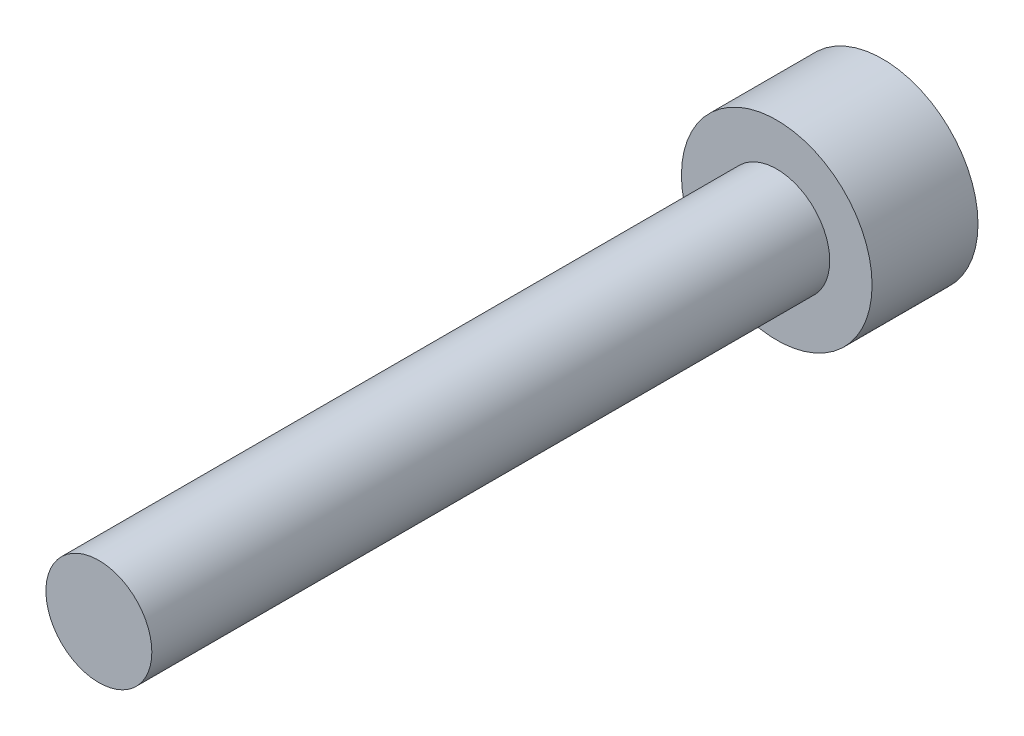
ISO-10303-21;
HEADER;
FILE_DESCRIPTION(('STEP AP214'),'2;1');
FILE_NAME('part.step','',(''),(''),'','','');
FILE_SCHEMA(('AUTOMOTIVE_DESIGN { 1 0 10303 214 1 1 1 1 }'));
ENDSEC;
DATA;
#1=APPLICATION_CONTEXT('core data for automotive mechanical design processes');
#2=APPLICATION_PROTOCOL_DEFINITION('international standard','automotive_design',2000,#1);
#3=PRODUCT_CONTEXT('',#1,'mechanical');
#4=PRODUCT('Part','Part','',(#3));
#5=PRODUCT_RELATED_PRODUCT_CATEGORY('part','',(#4));
#6=PRODUCT_DEFINITION_FORMATION('','',#4);
#7=PRODUCT_DEFINITION_CONTEXT('part definition',#1,'design');
#8=PRODUCT_DEFINITION('design','',#6,#7);
#9=PRODUCT_DEFINITION_SHAPE('','',#8);
#10=(LENGTH_UNIT() NAMED_UNIT(*) SI_UNIT(.MILLI.,.METRE.));
#11=(NAMED_UNIT(*) PLANE_ANGLE_UNIT() SI_UNIT($,.RADIAN.));
#12=(NAMED_UNIT(*) SI_UNIT($,.STERADIAN.) SOLID_ANGLE_UNIT());
#13=UNCERTAINTY_MEASURE_WITH_UNIT(LENGTH_MEASURE(1.E-05),#10,'distance_accuracy_value','');
#14=(GEOMETRIC_REPRESENTATION_CONTEXT(3) GLOBAL_UNCERTAINTY_ASSIGNED_CONTEXT((#13)) GLOBAL_UNIT_ASSIGNED_CONTEXT((#10,
#11,#12)) REPRESENTATION_CONTEXT('',''));
#15=CARTESIAN_POINT('',(0.,0.,0.));
#16=DIRECTION('',(0.,0.,1.));
#17=DIRECTION('',(1.,0.,0.));
#18=AXIS2_PLACEMENT_3D('',#15,#16,#17);
#19=CARTESIAN_POINT('',(0.,0.,-2.5));
#20=DIRECTION('',(0.,0.,1.));
#21=DIRECTION('',(1.,0.,0.));
#22=AXIS2_PLACEMENT_3D('',#19,#20,#21);
#23=PLANE('',#22);
#24=CARTESIAN_POINT('',(0.,0.,-2.5));
#25=DIRECTION('',(0.,0.,1.));
#26=DIRECTION('',(1.,0.,0.));
#27=AXIS2_PLACEMENT_3D('',#24,#25,#26);
#28=CIRCLE('',#27,2.25);
#29=CARTESIAN_POINT('',(2.25,0.,-2.5));
#30=VERTEX_POINT('',#29);
#31=EDGE_CURVE('E47',#30,#30,#28,.T.);
#32=ORIENTED_EDGE('',*,*,#31,.F.);
#33=EDGE_LOOP('',(#32));
#34=FACE_BOUND('',#33,.T.);
#35=DIRECTION('',(0.5,0.866025403784439,0.));
#36=VECTOR('',#35,1.);
#37=CARTESIAN_POINT('',(0.577350269189626,-1.,-2.5));
#38=LINE('',#37,#36);
#39=CARTESIAN_POINT('',(0.577350269189626,-1.,-2.5));
#40=VERTEX_POINT('',#39);
#41=CARTESIAN_POINT('',(1.15470053837925,0.,-2.5));
#42=VERTEX_POINT('',#41);
#43=EDGE_CURVE('E62',#40,#42,#38,.T.);
#44=ORIENTED_EDGE('',*,*,#43,.T.);
#45=DIRECTION('',(-0.5,0.866025403784439,0.));
#46=VECTOR('',#45,1.);
#47=CARTESIAN_POINT('',(1.15470053837925,0.,-2.5));
#48=LINE('',#47,#46);
#49=CARTESIAN_POINT('',(0.577350269189626,1.,-2.5));
#50=VERTEX_POINT('',#49);
#51=EDGE_CURVE('E138',#42,#50,#48,.T.);
#52=ORIENTED_EDGE('',*,*,#51,.T.);
#53=DIRECTION('',(-1.,0.,0.));
#54=VECTOR('',#53,1.);
#55=CARTESIAN_POINT('',(0.577350269189626,1.,-2.5));
#56=LINE('',#55,#54);
#57=CARTESIAN_POINT('',(-0.577350269189626,1.,-2.5));
#58=VERTEX_POINT('',#57);
#59=EDGE_CURVE('E141',#50,#58,#56,.T.);
#60=ORIENTED_EDGE('',*,*,#59,.T.);
#61=DIRECTION('',(-0.5,-0.866025403784438,0.));
#62=VECTOR('',#61,1.);
#63=CARTESIAN_POINT('',(-0.577350269189626,1.,-2.5));
#64=LINE('',#63,#62);
#65=CARTESIAN_POINT('',(-1.15470053837925,0.,-2.5));
#66=VERTEX_POINT('',#65);
#67=EDGE_CURVE('E150',#58,#66,#64,.T.);
#68=ORIENTED_EDGE('',*,*,#67,.T.);
#69=DIRECTION('',(0.5,-0.866025403784439,0.));
#70=VECTOR('',#69,1.);
#71=CARTESIAN_POINT('',(-1.15470053837925,0.,-2.5));
#72=LINE('',#71,#70);
#73=CARTESIAN_POINT('',(-0.577350269189626,-1.,-2.5));
#74=VERTEX_POINT('',#73);
#75=EDGE_CURVE('E125',#66,#74,#72,.T.);
#76=ORIENTED_EDGE('',*,*,#75,.T.);
#77=DIRECTION('',(1.,0.,0.));
#78=VECTOR('',#77,1.);
#79=CARTESIAN_POINT('',(-0.577350269189626,-1.,-2.5));
#80=LINE('',#79,#78);
#81=EDGE_CURVE('E155',#74,#40,#80,.T.);
#82=ORIENTED_EDGE('',*,*,#81,.T.);
#83=EDGE_LOOP('',(#44,#52,#60,#68,#76,#82));
#84=FACE_BOUND('',#83,.T.);
#85=ADVANCED_FACE('F44',(#34,#84),#23,.F.);
#86=CARTESIAN_POINT('',(0.,0.,0.));
#87=DIRECTION('',(0.,0.,-1.));
#88=DIRECTION('',(-1.,0.,0.));
#89=AXIS2_PLACEMENT_3D('',#86,#87,#88);
#90=CYLINDRICAL_SURFACE('',#89,2.25);
#91=CARTESIAN_POINT('',(0.,0.,0.));
#92=DIRECTION('',(0.,0.,1.));
#93=DIRECTION('',(1.,0.,0.));
#94=AXIS2_PLACEMENT_3D('',#91,#92,#93);
#95=CIRCLE('',#94,2.25);
#96=CARTESIAN_POINT('',(2.25,0.,0.));
#97=VERTEX_POINT('',#96);
#98=EDGE_CURVE('E54',#97,#97,#95,.T.);
#99=ORIENTED_EDGE('',*,*,#98,.F.);
#100=EDGE_LOOP('',(#99));
#101=FACE_BOUND('',#100,.T.);
#102=ORIENTED_EDGE('',*,*,#31,.T.);
#103=EDGE_LOOP('',(#102));
#104=FACE_BOUND('',#103,.T.);
#105=ADVANCED_FACE('F50',(#101,#104),#90,.T.);
#106=CARTESIAN_POINT('',(0.,0.,0.));
#107=DIRECTION('',(0.,0.,1.));
#108=DIRECTION('',(1.,0.,0.));
#109=AXIS2_PLACEMENT_3D('',#106,#107,#108);
#110=PLANE('',#109);
#111=CARTESIAN_POINT('',(0.,0.,0.));
#112=DIRECTION('',(0.,0.,1.));
#113=DIRECTION('',(1.,0.,0.));
#114=AXIS2_PLACEMENT_3D('',#111,#112,#113);
#115=CIRCLE('',#114,1.25);
#116=CARTESIAN_POINT('',(1.25,0.,0.));
#117=VERTEX_POINT('',#116);
#118=EDGE_CURVE('E11',#117,#117,#115,.T.);
#119=ORIENTED_EDGE('',*,*,#118,.F.);
#120=EDGE_LOOP('',(#119));
#121=FACE_BOUND('',#120,.T.);
#122=ORIENTED_EDGE('',*,*,#98,.T.);
#123=EDGE_LOOP('',(#122));
#124=FACE_BOUND('',#123,.T.);
#125=ADVANCED_FACE('F212',(#121,#124),#110,.T.);
#126=CARTESIAN_POINT('',(0.,0.,16.));
#127=DIRECTION('',(0.,0.,-1.));
#128=DIRECTION('',(-1.,0.,0.));
#129=AXIS2_PLACEMENT_3D('',#126,#127,#128);
#130=CYLINDRICAL_SURFACE('',#129,1.25);
#131=CARTESIAN_POINT('',(0.,0.,16.));
#132=DIRECTION('',(0.,0.,1.));
#133=DIRECTION('',(1.,0.,0.));
#134=AXIS2_PLACEMENT_3D('',#131,#132,#133);
#135=CIRCLE('',#134,1.25);
#136=CARTESIAN_POINT('',(1.25,0.,16.));
#137=VERTEX_POINT('',#136);
#138=EDGE_CURVE('E166',#137,#137,#135,.T.);
#139=ORIENTED_EDGE('',*,*,#138,.F.);
#140=EDGE_LOOP('',(#139));
#141=FACE_BOUND('',#140,.T.);
#142=ORIENTED_EDGE('',*,*,#118,.T.);
#143=EDGE_LOOP('',(#142));
#144=FACE_BOUND('',#143,.T.);
#145=ADVANCED_FACE('F209',(#141,#144),#130,.T.);
#146=CARTESIAN_POINT('',(0.,0.,16.));
#147=DIRECTION('',(0.,0.,1.));
#148=DIRECTION('',(1.,0.,0.));
#149=AXIS2_PLACEMENT_3D('',#146,#147,#148);
#150=PLANE('',#149);
#151=ORIENTED_EDGE('',*,*,#138,.T.);
#152=EDGE_LOOP('',(#151));
#153=FACE_BOUND('',#152,.T.);
#154=ADVANCED_FACE('F204',(#153),#150,.T.);
#155=CARTESIAN_POINT('',(0.577350269189626,-1.,-1.4));
#156=DIRECTION('',(-0.866025403784439,0.5,0.));
#157=DIRECTION('',(-0.5,-0.866025403784439,0.));
#158=AXIS2_PLACEMENT_3D('',#155,#156,#157);
#159=PLANE('',#158);
#160=ORIENTED_EDGE('',*,*,#43,.F.);
#161=DIRECTION('',(0.,0.,-1.));
#162=VECTOR('',#161,1.);
#163=CARTESIAN_POINT('',(0.577350269189626,-1.,-1.4));
#164=LINE('',#163,#162);
#165=CARTESIAN_POINT('',(0.577350269189626,-1.,-1.4));
#166=VERTEX_POINT('',#165);
#167=EDGE_CURVE('E132',#166,#40,#164,.T.);
#168=ORIENTED_EDGE('',*,*,#167,.F.);
#169=DIRECTION('',(0.5,0.866025403784439,0.));
#170=VECTOR('',#169,1.);
#171=CARTESIAN_POINT('',(0.577350269189626,-1.,-1.4));
#172=LINE('',#171,#170);
#173=CARTESIAN_POINT('',(1.15470053837925,0.,-1.4));
#174=VERTEX_POINT('',#173);
#175=EDGE_CURVE('E156',#166,#174,#172,.T.);
#176=ORIENTED_EDGE('',*,*,#175,.T.);
#177=DIRECTION('',(0.,0.,-1.));
#178=VECTOR('',#177,1.);
#179=CARTESIAN_POINT('',(1.15470053837925,0.,-1.4));
#180=LINE('',#179,#178);
#181=EDGE_CURVE('E167',#174,#42,#180,.T.);
#182=ORIENTED_EDGE('',*,*,#181,.T.);
#183=EDGE_LOOP('',(#160,#168,#176,#182));
#184=FACE_BOUND('',#183,.T.);
#185=ADVANCED_FACE('F184',(#184),#159,.T.);
#186=CARTESIAN_POINT('',(1.15470053837925,0.,-1.4));
#187=DIRECTION('',(-0.866025403784439,-0.5,0.));
#188=DIRECTION('',(0.5,-0.866025403784439,0.));
#189=AXIS2_PLACEMENT_3D('',#186,#187,#188);
#190=PLANE('',#189);
#191=ORIENTED_EDGE('',*,*,#51,.F.);
#192=ORIENTED_EDGE('',*,*,#181,.F.);
#193=DIRECTION('',(-0.5,0.866025403784439,0.));
#194=VECTOR('',#193,1.);
#195=CARTESIAN_POINT('',(1.15470053837925,0.,-1.4));
#196=LINE('',#195,#194);
#197=CARTESIAN_POINT('',(0.577350269189626,1.,-1.4));
#198=VERTEX_POINT('',#197);
#199=EDGE_CURVE('E105',#174,#198,#196,.T.);
#200=ORIENTED_EDGE('',*,*,#199,.T.);
#201=DIRECTION('',(0.,0.,-1.));
#202=VECTOR('',#201,1.);
#203=CARTESIAN_POINT('',(0.577350269189626,1.,-1.4));
#204=LINE('',#203,#202);
#205=EDGE_CURVE('E162',#198,#50,#204,.T.);
#206=ORIENTED_EDGE('',*,*,#205,.T.);
#207=EDGE_LOOP('',(#191,#192,#200,#206));
#208=FACE_BOUND('',#207,.T.);
#209=ADVANCED_FACE('F198',(#208),#190,.T.);
#210=CARTESIAN_POINT('',(0.577350269189626,1.,-1.4));
#211=DIRECTION('',(0.,-1.,0.));
#212=DIRECTION('',(1.,0.,0.));
#213=AXIS2_PLACEMENT_3D('',#210,#211,#212);
#214=PLANE('',#213);
#215=ORIENTED_EDGE('',*,*,#59,.F.);
#216=ORIENTED_EDGE('',*,*,#205,.F.);
#217=DIRECTION('',(-1.,0.,0.));
#218=VECTOR('',#217,1.);
#219=CARTESIAN_POINT('',(0.577350269189626,1.,-1.4));
#220=LINE('',#219,#218);
#221=CARTESIAN_POINT('',(-0.577350269189626,1.,-1.4));
#222=VERTEX_POINT('',#221);
#223=EDGE_CURVE('E121',#198,#222,#220,.T.);
#224=ORIENTED_EDGE('',*,*,#223,.T.);
#225=DIRECTION('',(0.,0.,-1.));
#226=VECTOR('',#225,1.);
#227=CARTESIAN_POINT('',(-0.577350269189626,1.,-1.4));
#228=LINE('',#227,#226);
#229=EDGE_CURVE('E119',#222,#58,#228,.T.);
#230=ORIENTED_EDGE('',*,*,#229,.T.);
#231=EDGE_LOOP('',(#215,#216,#224,#230));
#232=FACE_BOUND('',#231,.T.);
#233=ADVANCED_FACE('F193',(#232),#214,.T.);
#234=CARTESIAN_POINT('',(-0.577350269189626,1.,-1.4));
#235=DIRECTION('',(0.866025403784438,-0.5,0.));
#236=DIRECTION('',(0.5,0.866025403784438,0.));
#237=AXIS2_PLACEMENT_3D('',#234,#235,#236);
#238=PLANE('',#237);
#239=ORIENTED_EDGE('',*,*,#67,.F.);
#240=ORIENTED_EDGE('',*,*,#229,.F.);
#241=DIRECTION('',(-0.5,-0.866025403784438,0.));
#242=VECTOR('',#241,1.);
#243=CARTESIAN_POINT('',(-0.577350269189626,1.,-1.4));
#244=LINE('',#243,#242);
#245=CARTESIAN_POINT('',(-1.15470053837925,0.,-1.4));
#246=VERTEX_POINT('',#245);
#247=EDGE_CURVE('E115',#222,#246,#244,.T.);
#248=ORIENTED_EDGE('',*,*,#247,.T.);
#249=DIRECTION('',(0.,0.,-1.));
#250=VECTOR('',#249,1.);
#251=CARTESIAN_POINT('',(-1.15470053837925,0.,-1.4));
#252=LINE('',#251,#250);
#253=EDGE_CURVE('E118',#246,#66,#252,.T.);
#254=ORIENTED_EDGE('',*,*,#253,.T.);
#255=EDGE_LOOP('',(#239,#240,#248,#254));
#256=FACE_BOUND('',#255,.T.);
#257=ADVANCED_FACE('F113',(#256),#238,.T.);
#258=CARTESIAN_POINT('',(-1.15470053837925,0.,-1.4));
#259=DIRECTION('',(0.866025403784439,0.5,0.));
#260=DIRECTION('',(-0.5,0.866025403784439,0.));
#261=AXIS2_PLACEMENT_3D('',#258,#259,#260);
#262=PLANE('',#261);
#263=ORIENTED_EDGE('',*,*,#75,.F.);
#264=ORIENTED_EDGE('',*,*,#253,.F.);
#265=DIRECTION('',(0.5,-0.866025403784439,0.));
#266=VECTOR('',#265,1.);
#267=CARTESIAN_POINT('',(-1.15470053837925,0.,-1.4));
#268=LINE('',#267,#266);
#269=CARTESIAN_POINT('',(-0.577350269189626,-1.,-1.4));
#270=VERTEX_POINT('',#269);
#271=EDGE_CURVE('E116',#246,#270,#268,.T.);
#272=ORIENTED_EDGE('',*,*,#271,.T.);
#273=DIRECTION('',(0.,0.,-1.));
#274=VECTOR('',#273,1.);
#275=CARTESIAN_POINT('',(-0.577350269189626,-1.,-1.4));
#276=LINE('',#275,#274);
#277=EDGE_CURVE('E91',#270,#74,#276,.T.);
#278=ORIENTED_EDGE('',*,*,#277,.T.);
#279=EDGE_LOOP('',(#263,#264,#272,#278));
#280=FACE_BOUND('',#279,.T.);
#281=ADVANCED_FACE('F124',(#280),#262,.T.);
#282=CARTESIAN_POINT('',(-0.577350269189626,-1.,-1.4));
#283=DIRECTION('',(0.,1.,0.));
#284=DIRECTION('',(0.,0.,1.));
#285=AXIS2_PLACEMENT_3D('',#282,#283,#284);
#286=PLANE('',#285);
#287=ORIENTED_EDGE('',*,*,#81,.F.);
#288=ORIENTED_EDGE('',*,*,#277,.F.);
#289=DIRECTION('',(1.,0.,0.));
#290=VECTOR('',#289,1.);
#291=CARTESIAN_POINT('',(-0.577350269189626,-1.,-1.4));
#292=LINE('',#291,#290);
#293=EDGE_CURVE('E72',#270,#166,#292,.T.);
#294=ORIENTED_EDGE('',*,*,#293,.T.);
#295=ORIENTED_EDGE('',*,*,#167,.T.);
#296=EDGE_LOOP('',(#287,#288,#294,#295));
#297=FACE_BOUND('',#296,.T.);
#298=ADVANCED_FACE('F181',(#297),#286,.T.);
#299=CARTESIAN_POINT('',(0.,0.,-1.4));
#300=DIRECTION('',(0.,0.,1.));
#301=DIRECTION('',(1.,0.,0.));
#302=AXIS2_PLACEMENT_3D('',#299,#300,#301);
#303=PLANE('',#302);
#304=ORIENTED_EDGE('',*,*,#175,.F.);
#305=ORIENTED_EDGE('',*,*,#293,.F.);
#306=ORIENTED_EDGE('',*,*,#271,.F.);
#307=ORIENTED_EDGE('',*,*,#247,.F.);
#308=ORIENTED_EDGE('',*,*,#223,.F.);
#309=ORIENTED_EDGE('',*,*,#199,.F.);
#310=EDGE_LOOP('',(#304,#305,#306,#307,#308,#309));
#311=FACE_BOUND('',#310,.T.);
#312=ADVANCED_FACE('F129',(#311),#303,.F.);
#313=CLOSED_SHELL('',(#85,#105,#125,#145,#154,#185,#209,#233,#257,#281,#298,#312));
#314=MANIFOLD_SOLID_BREP('B2',#313);
#315=ADVANCED_BREP_SHAPE_REPRESENTATION('',(#18,#314),#14);
#316=SHAPE_DEFINITION_REPRESENTATION(#9,#315);
ENDSEC;
END-ISO-10303-21;
